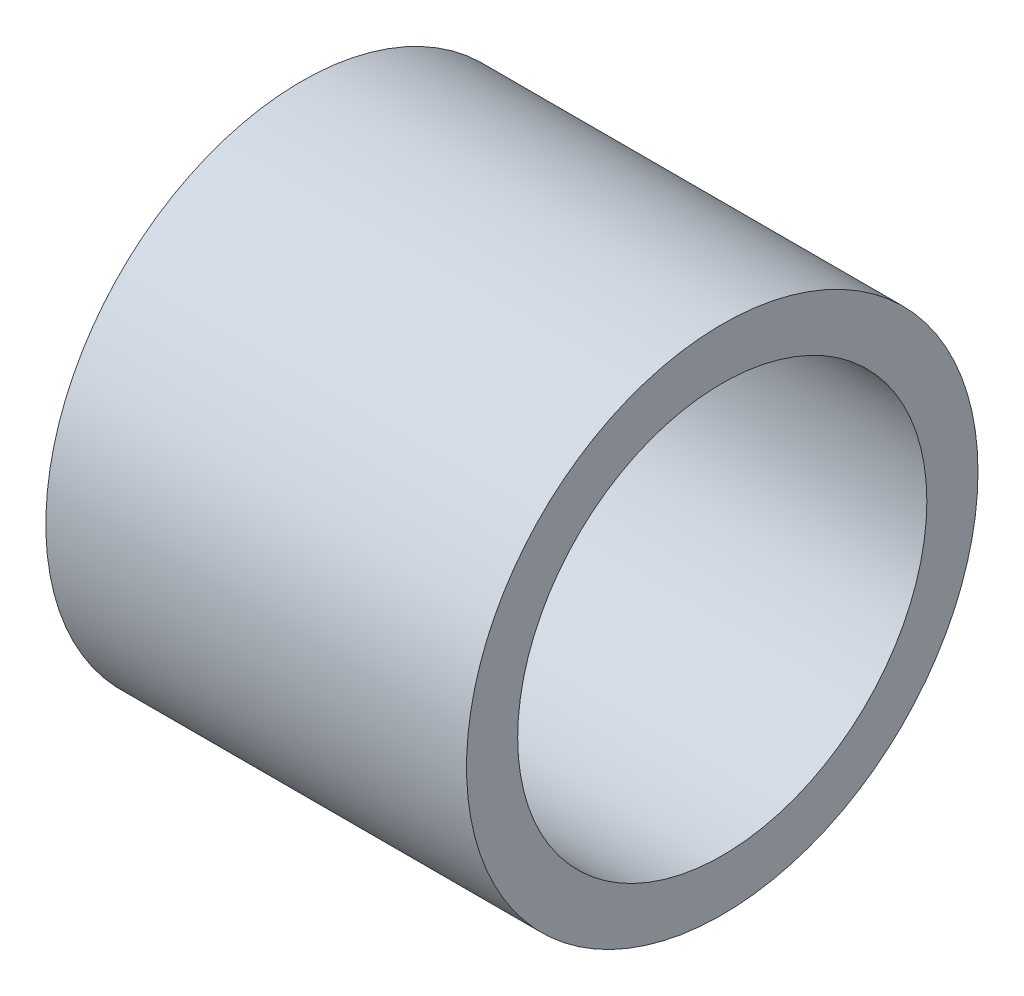
ISO-10303-21;
HEADER;
FILE_DESCRIPTION(('STEP AP214'),'2;1');
FILE_NAME('part.step','',(''),(''),'','','');
FILE_SCHEMA(('AUTOMOTIVE_DESIGN { 1 0 10303 214 1 1 1 1 }'));
ENDSEC;
DATA;
#1=APPLICATION_CONTEXT('core data for automotive mechanical design processes');
#2=APPLICATION_PROTOCOL_DEFINITION('international standard','automotive_design',2000,#1);
#3=PRODUCT_CONTEXT('',#1,'mechanical');
#4=PRODUCT('Part','Part','',(#3));
#5=PRODUCT_RELATED_PRODUCT_CATEGORY('part','',(#4));
#6=PRODUCT_DEFINITION_FORMATION('','',#4);
#7=PRODUCT_DEFINITION_CONTEXT('part definition',#1,'design');
#8=PRODUCT_DEFINITION('design','',#6,#7);
#9=PRODUCT_DEFINITION_SHAPE('','',#8);
#10=(LENGTH_UNIT() NAMED_UNIT(*) SI_UNIT(.MILLI.,.METRE.));
#11=(NAMED_UNIT(*) PLANE_ANGLE_UNIT() SI_UNIT($,.RADIAN.));
#12=(NAMED_UNIT(*) SI_UNIT($,.STERADIAN.) SOLID_ANGLE_UNIT());
#13=UNCERTAINTY_MEASURE_WITH_UNIT(LENGTH_MEASURE(1.E-05),#10,'distance_accuracy_value','');
#14=(GEOMETRIC_REPRESENTATION_CONTEXT(3) GLOBAL_UNCERTAINTY_ASSIGNED_CONTEXT((#13)) GLOBAL_UNIT_ASSIGNED_CONTEXT((#10,
#11,#12)) REPRESENTATION_CONTEXT('',''));
#15=CARTESIAN_POINT('',(0.,0.,0.));
#16=DIRECTION('',(0.,0.,1.));
#17=DIRECTION('',(1.,0.,0.));
#18=AXIS2_PLACEMENT_3D('',#15,#16,#17);
#19=CARTESIAN_POINT('',(26.115,0.,0.));
#20=DIRECTION('',(1.,0.,0.));
#21=DIRECTION('',(0.,0.,-1.));
#22=AXIS2_PLACEMENT_3D('',#19,#20,#21);
#23=PLANE('',#22);
#24=CARTESIAN_POINT('',(26.115,0.,0.));
#25=DIRECTION('',(1.,0.,0.));
#26=DIRECTION('',(0.,0.,-1.));
#27=AXIS2_PLACEMENT_3D('',#24,#25,#26);
#28=CIRCLE('',#27,15.875);
#29=CARTESIAN_POINT('',(26.115,0.,-15.875));
#30=VERTEX_POINT('',#29);
#31=EDGE_CURVE('E10',#30,#30,#28,.T.);
#32=ORIENTED_EDGE('',*,*,#31,.T.);
#33=EDGE_LOOP('',(#32));
#34=FACE_BOUND('',#33,.T.);
#35=CARTESIAN_POINT('',(26.115,0.,0.));
#36=DIRECTION('',(1.,0.,0.));
#37=DIRECTION('',(0.,0.,-1.));
#38=AXIS2_PLACEMENT_3D('',#35,#36,#37);
#39=CIRCLE('',#38,12.7);
#40=CARTESIAN_POINT('',(26.115,0.,-12.7));
#41=VERTEX_POINT('',#40);
#42=EDGE_CURVE('E40',#41,#41,#39,.T.);
#43=ORIENTED_EDGE('',*,*,#42,.F.);
#44=EDGE_LOOP('',(#43));
#45=FACE_BOUND('',#44,.T.);
#46=ADVANCED_FACE('F29',(#34,#45),#23,.T.);
#47=CARTESIAN_POINT('',(0.,0.,0.));
#48=DIRECTION('',(1.,0.,0.));
#49=DIRECTION('',(0.,0.,-1.));
#50=AXIS2_PLACEMENT_3D('',#47,#48,#49);
#51=PLANE('',#50);
#52=CARTESIAN_POINT('',(0.,0.,0.));
#53=DIRECTION('',(1.,0.,0.));
#54=DIRECTION('',(0.,0.,-1.));
#55=AXIS2_PLACEMENT_3D('',#52,#53,#54);
#56=CIRCLE('',#55,15.875);
#57=CARTESIAN_POINT('',(0.,0.,-15.875));
#58=VERTEX_POINT('',#57);
#59=EDGE_CURVE('E33',#58,#58,#56,.T.);
#60=ORIENTED_EDGE('',*,*,#59,.F.);
#61=EDGE_LOOP('',(#60));
#62=FACE_BOUND('',#61,.T.);
#63=CARTESIAN_POINT('',(0.,0.,0.));
#64=DIRECTION('',(1.,0.,0.));
#65=DIRECTION('',(0.,0.,-1.));
#66=AXIS2_PLACEMENT_3D('',#63,#64,#65);
#67=CIRCLE('',#66,12.7);
#68=CARTESIAN_POINT('',(0.,0.,-12.7));
#69=VERTEX_POINT('',#68);
#70=EDGE_CURVE('E42',#69,#69,#67,.T.);
#71=ORIENTED_EDGE('',*,*,#70,.T.);
#72=EDGE_LOOP('',(#71));
#73=FACE_BOUND('',#72,.T.);
#74=ADVANCED_FACE('F52',(#62,#73),#51,.F.);
#75=CARTESIAN_POINT('',(26.115,0.,0.));
#76=DIRECTION('',(-1.,0.,0.));
#77=DIRECTION('',(0.,0.,1.));
#78=AXIS2_PLACEMENT_3D('',#75,#76,#77);
#79=CYLINDRICAL_SURFACE('',#78,15.875);
#80=ORIENTED_EDGE('',*,*,#31,.F.);
#81=EDGE_LOOP('',(#80));
#82=FACE_BOUND('',#81,.T.);
#83=ORIENTED_EDGE('',*,*,#59,.T.);
#84=EDGE_LOOP('',(#83));
#85=FACE_BOUND('',#84,.T.);
#86=ADVANCED_FACE('F31',(#82,#85),#79,.T.);
#87=CARTESIAN_POINT('',(26.115,0.,0.));
#88=DIRECTION('',(-1.,0.,0.));
#89=DIRECTION('',(0.,0.,1.));
#90=AXIS2_PLACEMENT_3D('',#87,#88,#89);
#91=CYLINDRICAL_SURFACE('',#90,12.7);
#92=ORIENTED_EDGE('',*,*,#42,.T.);
#93=EDGE_LOOP('',(#92));
#94=FACE_BOUND('',#93,.T.);
#95=ORIENTED_EDGE('',*,*,#70,.F.);
#96=EDGE_LOOP('',(#95));
#97=FACE_BOUND('',#96,.T.);
#98=ADVANCED_FACE('F48',(#94,#97),#91,.F.);
#99=CLOSED_SHELL('',(#46,#74,#86,#98));
#100=MANIFOLD_SOLID_BREP('B2',#99);
#101=ADVANCED_BREP_SHAPE_REPRESENTATION('',(#18,#100),#14);
#102=SHAPE_DEFINITION_REPRESENTATION(#9,#101);
ENDSEC;
END-ISO-10303-21;
